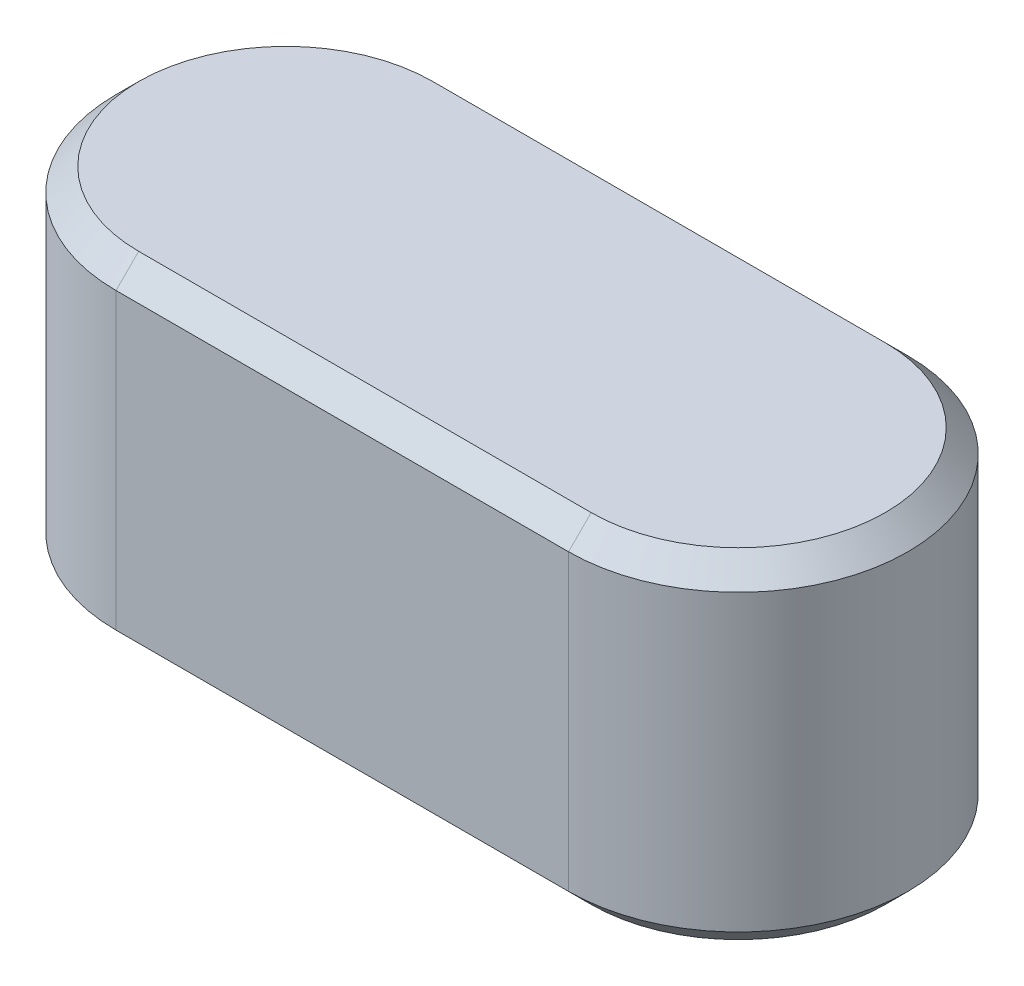
ISO-10303-21;
HEADER;
FILE_DESCRIPTION(('STEP AP214'),'2;1');
FILE_NAME('part.step','',(''),(''),'','','');
FILE_SCHEMA(('AUTOMOTIVE_DESIGN { 1 0 10303 214 1 1 1 1 }'));
ENDSEC;
DATA;
#1=APPLICATION_CONTEXT('core data for automotive mechanical design processes');
#2=APPLICATION_PROTOCOL_DEFINITION('international standard','automotive_design',2000,#1);
#3=PRODUCT_CONTEXT('',#1,'mechanical');
#4=PRODUCT('Part','Part','',(#3));
#5=PRODUCT_RELATED_PRODUCT_CATEGORY('part','',(#4));
#6=PRODUCT_DEFINITION_FORMATION('','',#4);
#7=PRODUCT_DEFINITION_CONTEXT('part definition',#1,'design');
#8=PRODUCT_DEFINITION('design','',#6,#7);
#9=PRODUCT_DEFINITION_SHAPE('','',#8);
#10=(LENGTH_UNIT() NAMED_UNIT(*) SI_UNIT(.MILLI.,.METRE.));
#11=(NAMED_UNIT(*) PLANE_ANGLE_UNIT() SI_UNIT($,.RADIAN.));
#12=(NAMED_UNIT(*) SI_UNIT($,.STERADIAN.) SOLID_ANGLE_UNIT());
#13=UNCERTAINTY_MEASURE_WITH_UNIT(LENGTH_MEASURE(1.E-05),#10,'distance_accuracy_value','');
#14=(GEOMETRIC_REPRESENTATION_CONTEXT(3) GLOBAL_UNCERTAINTY_ASSIGNED_CONTEXT((#13)) GLOBAL_UNIT_ASSIGNED_CONTEXT((#10,
#11,#12)) REPRESENTATION_CONTEXT('',''));
#15=CARTESIAN_POINT('',(0.,0.,0.));
#16=DIRECTION('',(0.,0.,1.));
#17=DIRECTION('',(1.,0.,0.));
#18=AXIS2_PLACEMENT_3D('',#15,#16,#17);
#19=CARTESIAN_POINT('',(11.,5.8,0.));
#20=DIRECTION('',(0.,-1.,0.));
#21=DIRECTION('',(0.,0.,-1.));
#22=AXIS2_PLACEMENT_3D('',#19,#20,#21);
#23=CONICAL_SURFACE('',#22,2.8,0.785398163397448);
#24=DIRECTION('',(0.,0.707106781186548,-0.707106781186547));
#25=VECTOR('',#24,1.);
#26=CARTESIAN_POINT('',(11.,6.,2.6));
#27=LINE('',#26,#25);
#28=CARTESIAN_POINT('',(11.,5.6,3.));
#29=VERTEX_POINT('',#28);
#30=CARTESIAN_POINT('',(11.,6.,2.6));
#31=VERTEX_POINT('',#30);
#32=EDGE_CURVE('E33',#29,#31,#27,.T.);
#33=ORIENTED_EDGE('',*,*,#32,.F.);
#34=CARTESIAN_POINT('',(11.,5.6,0.));
#35=DIRECTION('',(0.,-1.,0.));
#36=DIRECTION('',(0.,0.,-1.));
#37=AXIS2_PLACEMENT_3D('',#34,#35,#36);
#38=CIRCLE('',#37,3.);
#39=CARTESIAN_POINT('',(11.,5.6,-3.));
#40=VERTEX_POINT('',#39);
#41=EDGE_CURVE('E25',#40,#29,#38,.T.);
#42=ORIENTED_EDGE('',*,*,#41,.F.);
#43=DIRECTION('',(0.,-0.707106781186548,-0.707106781186548));
#44=VECTOR('',#43,1.);
#45=CARTESIAN_POINT('',(11.,5.6,-3.));
#46=LINE('',#45,#44);
#47=CARTESIAN_POINT('',(11.,6.,-2.6));
#48=VERTEX_POINT('',#47);
#49=EDGE_CURVE('E152',#48,#40,#46,.T.);
#50=ORIENTED_EDGE('',*,*,#49,.F.);
#51=CARTESIAN_POINT('',(11.,6.,0.));
#52=DIRECTION('',(0.,-1.,0.));
#53=DIRECTION('',(0.,0.,-1.));
#54=AXIS2_PLACEMENT_3D('',#51,#52,#53);
#55=CIRCLE('',#54,2.6);
#56=EDGE_CURVE('E10',#48,#31,#55,.T.);
#57=ORIENTED_EDGE('',*,*,#56,.T.);
#58=EDGE_LOOP('',(#33,#42,#50,#57));
#59=FACE_BOUND('',#58,.T.);
#60=ADVANCED_FACE('F15',(#59),#23,.T.);
#61=CARTESIAN_POINT('',(11.,3.,0.));
#62=DIRECTION('',(0.,1.,0.));
#63=DIRECTION('',(0.,0.,-1.));
#64=AXIS2_PLACEMENT_3D('',#61,#62,#63);
#65=CYLINDRICAL_SURFACE('',#64,3.);
#66=DIRECTION('',(0.,1.,0.));
#67=VECTOR('',#66,1.);
#68=CARTESIAN_POINT('',(11.,5.6,3.));
#69=LINE('',#68,#67);
#70=CARTESIAN_POINT('',(11.,0.4,3.));
#71=VERTEX_POINT('',#70);
#72=EDGE_CURVE('E104',#71,#29,#69,.T.);
#73=ORIENTED_EDGE('',*,*,#72,.F.);
#74=CARTESIAN_POINT('',(11.,0.4,0.));
#75=DIRECTION('',(0.,-1.,0.));
#76=DIRECTION('',(0.,0.,-1.));
#77=AXIS2_PLACEMENT_3D('',#74,#75,#76);
#78=CIRCLE('',#77,3.);
#79=CARTESIAN_POINT('',(11.,0.4,-3.));
#80=VERTEX_POINT('',#79);
#81=EDGE_CURVE('E133',#80,#71,#78,.T.);
#82=ORIENTED_EDGE('',*,*,#81,.F.);
#83=DIRECTION('',(0.,-1.,0.));
#84=VECTOR('',#83,1.);
#85=CARTESIAN_POINT('',(11.,0.4,-3.));
#86=LINE('',#85,#84);
#87=EDGE_CURVE('E147',#40,#80,#86,.T.);
#88=ORIENTED_EDGE('',*,*,#87,.F.);
#89=ORIENTED_EDGE('',*,*,#41,.T.);
#90=EDGE_LOOP('',(#73,#82,#88,#89));
#91=FACE_BOUND('',#90,.T.);
#92=ADVANCED_FACE('F144',(#91),#65,.T.);
#93=CARTESIAN_POINT('',(11.,0.2,0.));
#94=DIRECTION('',(0.,1.,0.));
#95=DIRECTION('',(0.,0.,-1.));
#96=AXIS2_PLACEMENT_3D('',#93,#94,#95);
#97=CONICAL_SURFACE('',#96,2.8,0.785398163397448);
#98=DIRECTION('',(0.,0.707106781186548,0.707106781186548));
#99=VECTOR('',#98,1.);
#100=CARTESIAN_POINT('',(11.,0.4,3.));
#101=LINE('',#100,#99);
#102=CARTESIAN_POINT('',(11.,0.,2.6));
#103=VERTEX_POINT('',#102);
#104=EDGE_CURVE('E117',#103,#71,#101,.T.);
#105=ORIENTED_EDGE('',*,*,#104,.F.);
#106=CARTESIAN_POINT('',(11.,0.,0.));
#107=DIRECTION('',(0.,-1.,0.));
#108=DIRECTION('',(0.,0.,-1.));
#109=AXIS2_PLACEMENT_3D('',#106,#107,#108);
#110=CIRCLE('',#109,2.6);
#111=CARTESIAN_POINT('',(11.,0.,-2.6));
#112=VERTEX_POINT('',#111);
#113=EDGE_CURVE('E163',#112,#103,#110,.T.);
#114=ORIENTED_EDGE('',*,*,#113,.F.);
#115=DIRECTION('',(0.,-0.707106781186547,0.707106781186548));
#116=VECTOR('',#115,1.);
#117=CARTESIAN_POINT('',(11.,0.,-2.6));
#118=LINE('',#117,#116);
#119=EDGE_CURVE('E157',#80,#112,#118,.T.);
#120=ORIENTED_EDGE('',*,*,#119,.F.);
#121=ORIENTED_EDGE('',*,*,#81,.T.);
#122=EDGE_LOOP('',(#105,#114,#120,#121));
#123=FACE_BOUND('',#122,.T.);
#124=ADVANCED_FACE('F191',(#123),#97,.T.);
#125=CARTESIAN_POINT('',(3.,0.2,0.));
#126=DIRECTION('',(0.,1.,0.));
#127=DIRECTION('',(0.,0.,-1.));
#128=AXIS2_PLACEMENT_3D('',#125,#126,#127);
#129=CONICAL_SURFACE('',#128,2.8,0.785398163397448);
#130=DIRECTION('',(0.,-0.707106781186548,-0.707106781186548));
#131=VECTOR('',#130,1.);
#132=CARTESIAN_POINT('',(3.,0.4,3.));
#133=LINE('',#132,#131);
#134=CARTESIAN_POINT('',(3.,0.4,3.));
#135=VERTEX_POINT('',#134);
#136=CARTESIAN_POINT('',(3.,0.,2.6));
#137=VERTEX_POINT('',#136);
#138=EDGE_CURVE('E109',#135,#137,#133,.T.);
#139=ORIENTED_EDGE('',*,*,#138,.F.);
#140=CARTESIAN_POINT('',(3.,0.4,0.));
#141=DIRECTION('',(0.,1.,0.));
#142=DIRECTION('',(0.,0.,-1.));
#143=AXIS2_PLACEMENT_3D('',#140,#141,#142);
#144=CIRCLE('',#143,3.);
#145=CARTESIAN_POINT('',(3.,0.4,-3.));
#146=VERTEX_POINT('',#145);
#147=EDGE_CURVE('E111',#146,#135,#144,.T.);
#148=ORIENTED_EDGE('',*,*,#147,.F.);
#149=DIRECTION('',(0.,0.707106781186547,-0.707106781186548));
#150=VECTOR('',#149,1.);
#151=CARTESIAN_POINT('',(3.,0.,-2.6));
#152=LINE('',#151,#150);
#153=CARTESIAN_POINT('',(3.,0.,-2.6));
#154=VERTEX_POINT('',#153);
#155=EDGE_CURVE('E19',#154,#146,#152,.T.);
#156=ORIENTED_EDGE('',*,*,#155,.F.);
#157=CARTESIAN_POINT('',(3.,0.,0.));
#158=DIRECTION('',(0.,1.,0.));
#159=DIRECTION('',(0.,0.,-1.));
#160=AXIS2_PLACEMENT_3D('',#157,#158,#159);
#161=CIRCLE('',#160,2.6);
#162=EDGE_CURVE('E113',#154,#137,#161,.T.);
#163=ORIENTED_EDGE('',*,*,#162,.T.);
#164=EDGE_LOOP('',(#139,#148,#156,#163));
#165=FACE_BOUND('',#164,.T.);
#166=ADVANCED_FACE('F110',(#165),#129,.T.);
#167=CARTESIAN_POINT('',(3.,3.,0.));
#168=DIRECTION('',(0.,-1.,0.));
#169=DIRECTION('',(0.,0.,-1.));
#170=AXIS2_PLACEMENT_3D('',#167,#168,#169);
#171=CYLINDRICAL_SURFACE('',#170,3.);
#172=DIRECTION('',(0.,-1.,0.));
#173=VECTOR('',#172,1.);
#174=CARTESIAN_POINT('',(3.,5.6,3.));
#175=LINE('',#174,#173);
#176=CARTESIAN_POINT('',(3.,5.6,3.));
#177=VERTEX_POINT('',#176);
#178=EDGE_CURVE('E94',#177,#135,#175,.T.);
#179=ORIENTED_EDGE('',*,*,#178,.F.);
#180=CARTESIAN_POINT('',(3.,5.6,0.));
#181=DIRECTION('',(0.,1.,0.));
#182=DIRECTION('',(0.,0.,-1.));
#183=AXIS2_PLACEMENT_3D('',#180,#181,#182);
#184=CIRCLE('',#183,3.);
#185=CARTESIAN_POINT('',(3.,5.6,-3.));
#186=VERTEX_POINT('',#185);
#187=EDGE_CURVE('E121',#186,#177,#184,.T.);
#188=ORIENTED_EDGE('',*,*,#187,.F.);
#189=DIRECTION('',(0.,1.,0.));
#190=VECTOR('',#189,1.);
#191=CARTESIAN_POINT('',(3.,0.4,-3.));
#192=LINE('',#191,#190);
#193=EDGE_CURVE('E75',#146,#186,#192,.T.);
#194=ORIENTED_EDGE('',*,*,#193,.F.);
#195=ORIENTED_EDGE('',*,*,#147,.T.);
#196=EDGE_LOOP('',(#179,#188,#194,#195));
#197=FACE_BOUND('',#196,.T.);
#198=ADVANCED_FACE('F120',(#197),#171,.T.);
#199=CARTESIAN_POINT('',(3.,5.8,0.));
#200=DIRECTION('',(0.,-1.,0.));
#201=DIRECTION('',(0.,0.,-1.));
#202=AXIS2_PLACEMENT_3D('',#199,#200,#201);
#203=CONICAL_SURFACE('',#202,2.8,0.785398163397448);
#204=DIRECTION('',(0.,-0.707106781186548,0.707106781186547));
#205=VECTOR('',#204,1.);
#206=CARTESIAN_POINT('',(3.,6.,2.6));
#207=LINE('',#206,#205);
#208=CARTESIAN_POINT('',(3.,6.,2.6));
#209=VERTEX_POINT('',#208);
#210=EDGE_CURVE('E82',#209,#177,#207,.T.);
#211=ORIENTED_EDGE('',*,*,#210,.F.);
#212=CARTESIAN_POINT('',(3.,6.,0.));
#213=DIRECTION('',(0.,1.,0.));
#214=DIRECTION('',(0.,0.,-1.));
#215=AXIS2_PLACEMENT_3D('',#212,#213,#214);
#216=CIRCLE('',#215,2.6);
#217=CARTESIAN_POINT('',(3.,6.,-2.6));
#218=VERTEX_POINT('',#217);
#219=EDGE_CURVE('E68',#218,#209,#216,.T.);
#220=ORIENTED_EDGE('',*,*,#219,.F.);
#221=DIRECTION('',(0.,0.707106781186548,0.707106781186548));
#222=VECTOR('',#221,1.);
#223=CARTESIAN_POINT('',(3.,5.6,-3.));
#224=LINE('',#223,#222);
#225=EDGE_CURVE('E168',#186,#218,#224,.T.);
#226=ORIENTED_EDGE('',*,*,#225,.F.);
#227=ORIENTED_EDGE('',*,*,#187,.T.);
#228=EDGE_LOOP('',(#211,#220,#226,#227));
#229=FACE_BOUND('',#228,.T.);
#230=ADVANCED_FACE('F17',(#229),#203,.T.);
#231=CARTESIAN_POINT('',(3.,0.2,2.8));
#232=DIRECTION('',(0.,-0.707106781186548,0.707106781186548));
#233=DIRECTION('',(0.,-0.707106781186548,-0.707106781186548));
#234=AXIS2_PLACEMENT_3D('',#231,#232,#233);
#235=PLANE('',#234);
#236=ORIENTED_EDGE('',*,*,#104,.T.);
#237=DIRECTION('',(1.,0.,0.));
#238=VECTOR('',#237,1.);
#239=CARTESIAN_POINT('',(3.,0.4,3.));
#240=LINE('',#239,#238);
#241=EDGE_CURVE('E98',#135,#71,#240,.T.);
#242=ORIENTED_EDGE('',*,*,#241,.F.);
#243=ORIENTED_EDGE('',*,*,#138,.T.);
#244=DIRECTION('',(1.,0.,0.));
#245=VECTOR('',#244,1.);
#246=CARTESIAN_POINT('',(3.,0.,2.6));
#247=LINE('',#246,#245);
#248=EDGE_CURVE('E118',#137,#103,#247,.T.);
#249=ORIENTED_EDGE('',*,*,#248,.T.);
#250=EDGE_LOOP('',(#236,#242,#243,#249));
#251=FACE_BOUND('',#250,.T.);
#252=ADVANCED_FACE('F124',(#251),#235,.T.);
#253=CARTESIAN_POINT('',(3.,3.,3.));
#254=DIRECTION('',(0.,0.,1.));
#255=DIRECTION('',(0.,-1.,0.));
#256=AXIS2_PLACEMENT_3D('',#253,#254,#255);
#257=PLANE('',#256);
#258=ORIENTED_EDGE('',*,*,#72,.T.);
#259=DIRECTION('',(1.,0.,0.));
#260=VECTOR('',#259,1.);
#261=CARTESIAN_POINT('',(3.,5.6,3.));
#262=LINE('',#261,#260);
#263=EDGE_CURVE('E99',#177,#29,#262,.T.);
#264=ORIENTED_EDGE('',*,*,#263,.F.);
#265=ORIENTED_EDGE('',*,*,#178,.T.);
#266=ORIENTED_EDGE('',*,*,#241,.T.);
#267=EDGE_LOOP('',(#258,#264,#265,#266));
#268=FACE_BOUND('',#267,.T.);
#269=ADVANCED_FACE('F96',(#268),#257,.T.);
#270=CARTESIAN_POINT('',(3.,5.8,2.8));
#271=DIRECTION('',(0.,0.707106781186547,0.707106781186548));
#272=DIRECTION('',(0.,-0.707106781186548,0.707106781186547));
#273=AXIS2_PLACEMENT_3D('',#270,#271,#272);
#274=PLANE('',#273);
#275=ORIENTED_EDGE('',*,*,#32,.T.);
#276=DIRECTION('',(1.,0.,0.));
#277=VECTOR('',#276,1.);
#278=CARTESIAN_POINT('',(3.,6.,2.6));
#279=LINE('',#278,#277);
#280=EDGE_CURVE('E141',#209,#31,#279,.T.);
#281=ORIENTED_EDGE('',*,*,#280,.F.);
#282=ORIENTED_EDGE('',*,*,#210,.T.);
#283=ORIENTED_EDGE('',*,*,#263,.T.);
#284=EDGE_LOOP('',(#275,#281,#282,#283));
#285=FACE_BOUND('',#284,.T.);
#286=ADVANCED_FACE('F150',(#285),#274,.T.);
#287=CARTESIAN_POINT('',(3.,6.,0.));
#288=DIRECTION('',(0.,1.,0.));
#289=DIRECTION('',(0.,0.,1.));
#290=AXIS2_PLACEMENT_3D('',#287,#288,#289);
#291=PLANE('',#290);
#292=ORIENTED_EDGE('',*,*,#280,.T.);
#293=ORIENTED_EDGE('',*,*,#56,.F.);
#294=DIRECTION('',(1.,0.,0.));
#295=VECTOR('',#294,1.);
#296=CARTESIAN_POINT('',(3.,6.,-2.6));
#297=LINE('',#296,#295);
#298=EDGE_CURVE('E131',#218,#48,#297,.T.);
#299=ORIENTED_EDGE('',*,*,#298,.F.);
#300=ORIENTED_EDGE('',*,*,#219,.T.);
#301=EDGE_LOOP('',(#292,#293,#299,#300));
#302=FACE_BOUND('',#301,.T.);
#303=ADVANCED_FACE('F154',(#302),#291,.T.);
#304=CARTESIAN_POINT('',(3.,5.8,-2.8));
#305=DIRECTION('',(0.,0.707106781186548,-0.707106781186548));
#306=DIRECTION('',(0.,0.707106781186548,0.707106781186548));
#307=AXIS2_PLACEMENT_3D('',#304,#305,#306);
#308=PLANE('',#307);
#309=ORIENTED_EDGE('',*,*,#49,.T.);
#310=DIRECTION('',(1.,0.,0.));
#311=VECTOR('',#310,1.);
#312=CARTESIAN_POINT('',(3.,5.6,-3.));
#313=LINE('',#312,#311);
#314=EDGE_CURVE('E160',#186,#40,#313,.T.);
#315=ORIENTED_EDGE('',*,*,#314,.F.);
#316=ORIENTED_EDGE('',*,*,#225,.T.);
#317=ORIENTED_EDGE('',*,*,#298,.T.);
#318=EDGE_LOOP('',(#309,#315,#316,#317));
#319=FACE_BOUND('',#318,.T.);
#320=ADVANCED_FACE('F175',(#319),#308,.T.);
#321=CARTESIAN_POINT('',(3.,3.,-3.));
#322=DIRECTION('',(0.,0.,-1.));
#323=DIRECTION('',(0.,1.,0.));
#324=AXIS2_PLACEMENT_3D('',#321,#322,#323);
#325=PLANE('',#324);
#326=ORIENTED_EDGE('',*,*,#87,.T.);
#327=DIRECTION('',(1.,0.,0.));
#328=VECTOR('',#327,1.);
#329=CARTESIAN_POINT('',(3.,0.4,-3.));
#330=LINE('',#329,#328);
#331=EDGE_CURVE('E136',#146,#80,#330,.T.);
#332=ORIENTED_EDGE('',*,*,#331,.F.);
#333=ORIENTED_EDGE('',*,*,#193,.T.);
#334=ORIENTED_EDGE('',*,*,#314,.T.);
#335=EDGE_LOOP('',(#326,#332,#333,#334));
#336=FACE_BOUND('',#335,.T.);
#337=ADVANCED_FACE('F209',(#336),#325,.T.);
#338=CARTESIAN_POINT('',(3.,0.2,-2.8));
#339=DIRECTION('',(0.,-0.707106781186548,-0.707106781186547));
#340=DIRECTION('',(0.,0.707106781186547,-0.707106781186548));
#341=AXIS2_PLACEMENT_3D('',#338,#339,#340);
#342=PLANE('',#341);
#343=ORIENTED_EDGE('',*,*,#119,.T.);
#344=DIRECTION('',(1.,0.,0.));
#345=VECTOR('',#344,1.);
#346=CARTESIAN_POINT('',(3.,0.,-2.6));
#347=LINE('',#346,#345);
#348=EDGE_CURVE('E138',#154,#112,#347,.T.);
#349=ORIENTED_EDGE('',*,*,#348,.F.);
#350=ORIENTED_EDGE('',*,*,#155,.T.);
#351=ORIENTED_EDGE('',*,*,#331,.T.);
#352=EDGE_LOOP('',(#343,#349,#350,#351));
#353=FACE_BOUND('',#352,.T.);
#354=ADVANCED_FACE('F211',(#353),#342,.T.);
#355=CARTESIAN_POINT('',(3.,0.,0.));
#356=DIRECTION('',(0.,-1.,0.));
#357=DIRECTION('',(0.,0.,-1.));
#358=AXIS2_PLACEMENT_3D('',#355,#356,#357);
#359=PLANE('',#358);
#360=ORIENTED_EDGE('',*,*,#348,.T.);
#361=ORIENTED_EDGE('',*,*,#113,.T.);
#362=ORIENTED_EDGE('',*,*,#248,.F.);
#363=ORIENTED_EDGE('',*,*,#162,.F.);
#364=EDGE_LOOP('',(#360,#361,#362,#363));
#365=FACE_BOUND('',#364,.T.);
#366=ADVANCED_FACE('F195',(#365),#359,.T.);
#367=CLOSED_SHELL('',(#60,#92,#124,#166,#198,#230,#252,#269,#286,#303,#320,#337,#354,#366));
#368=MANIFOLD_SOLID_BREP('B1',#367);
#369=ADVANCED_BREP_SHAPE_REPRESENTATION('',(#18,#368),#14);
#370=SHAPE_DEFINITION_REPRESENTATION(#9,#369);
ENDSEC;
END-ISO-10303-21;
